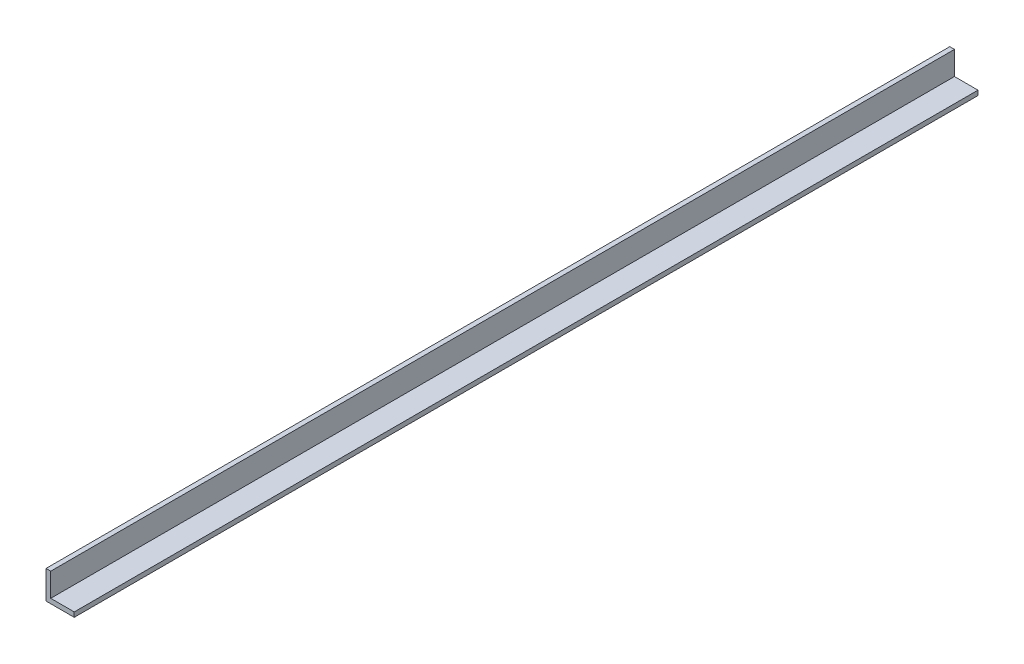
ISO-10303-21;
HEADER;
FILE_DESCRIPTION(('STEP AP214'),'2;1');
FILE_NAME('part.step','',(''),(''),'','','');
FILE_SCHEMA(('AUTOMOTIVE_DESIGN { 1 0 10303 214 1 1 1 1 }'));
ENDSEC;
DATA;
#1=APPLICATION_CONTEXT('core data for automotive mechanical design processes');
#2=APPLICATION_PROTOCOL_DEFINITION('international standard','automotive_design',2000,#1);
#3=PRODUCT_CONTEXT('',#1,'mechanical');
#4=PRODUCT('Part','Part','',(#3));
#5=PRODUCT_RELATED_PRODUCT_CATEGORY('part','',(#4));
#6=PRODUCT_DEFINITION_FORMATION('','',#4);
#7=PRODUCT_DEFINITION_CONTEXT('part definition',#1,'design');
#8=PRODUCT_DEFINITION('design','',#6,#7);
#9=PRODUCT_DEFINITION_SHAPE('','',#8);
#10=(LENGTH_UNIT() NAMED_UNIT(*) SI_UNIT(.MILLI.,.METRE.));
#11=(NAMED_UNIT(*) PLANE_ANGLE_UNIT() SI_UNIT($,.RADIAN.));
#12=(NAMED_UNIT(*) SI_UNIT($,.STERADIAN.) SOLID_ANGLE_UNIT());
#13=UNCERTAINTY_MEASURE_WITH_UNIT(LENGTH_MEASURE(1.E-05),#10,'distance_accuracy_value','');
#14=(GEOMETRIC_REPRESENTATION_CONTEXT(3) GLOBAL_UNCERTAINTY_ASSIGNED_CONTEXT((#13)) GLOBAL_UNIT_ASSIGNED_CONTEXT((#10,
#11,#12)) REPRESENTATION_CONTEXT('',''));
#15=CARTESIAN_POINT('',(0.,0.,0.));
#16=DIRECTION('',(0.,0.,1.));
#17=DIRECTION('',(1.,0.,0.));
#18=AXIS2_PLACEMENT_3D('',#15,#16,#17);
#19=CARTESIAN_POINT('',(0.,19.05,609.6));
#20=DIRECTION('',(1.,0.,0.));
#21=DIRECTION('',(0.,1.,0.));
#22=AXIS2_PLACEMENT_3D('',#19,#20,#21);
#23=PLANE('',#22);
#24=DIRECTION('',(0.,-1.,0.));
#25=VECTOR('',#24,1.);
#26=CARTESIAN_POINT('',(0.,19.05,0.));
#27=LINE('',#26,#25);
#28=CARTESIAN_POINT('',(0.,19.05,0.));
#29=VERTEX_POINT('',#28);
#30=CARTESIAN_POINT('',(0.,0.,0.));
#31=VERTEX_POINT('',#30);
#32=EDGE_CURVE('E114',#29,#31,#27,.T.);
#33=ORIENTED_EDGE('',*,*,#32,.T.);
#34=DIRECTION('',(0.,0.,-1.));
#35=VECTOR('',#34,1.);
#36=CARTESIAN_POINT('',(0.,0.,609.6));
#37=LINE('',#36,#35);
#38=CARTESIAN_POINT('',(0.,0.,609.6));
#39=VERTEX_POINT('',#38);
#40=EDGE_CURVE('E11',#39,#31,#37,.T.);
#41=ORIENTED_EDGE('',*,*,#40,.F.);
#42=DIRECTION('',(0.,-1.,0.));
#43=VECTOR('',#42,1.);
#44=CARTESIAN_POINT('',(0.,19.05,609.6));
#45=LINE('',#44,#43);
#46=CARTESIAN_POINT('',(0.,19.05,609.6));
#47=VERTEX_POINT('',#46);
#48=EDGE_CURVE('E124',#47,#39,#45,.T.);
#49=ORIENTED_EDGE('',*,*,#48,.F.);
#50=DIRECTION('',(0.,0.,-1.));
#51=VECTOR('',#50,1.);
#52=CARTESIAN_POINT('',(0.,19.05,609.6));
#53=LINE('',#52,#51);
#54=EDGE_CURVE('E110',#47,#29,#53,.T.);
#55=ORIENTED_EDGE('',*,*,#54,.T.);
#56=EDGE_LOOP('',(#33,#41,#49,#55));
#57=FACE_BOUND('',#56,.T.);
#58=ADVANCED_FACE('F30',(#57),#23,.F.);
#59=CARTESIAN_POINT('',(0.,0.,609.6));
#60=DIRECTION('',(0.,1.,0.));
#61=DIRECTION('',(0.,0.,1.));
#62=AXIS2_PLACEMENT_3D('',#59,#60,#61);
#63=PLANE('',#62);
#64=DIRECTION('',(1.,0.,0.));
#65=VECTOR('',#64,1.);
#66=CARTESIAN_POINT('',(0.,0.,0.));
#67=LINE('',#66,#65);
#68=CARTESIAN_POINT('',(19.05,0.,0.));
#69=VERTEX_POINT('',#68);
#70=EDGE_CURVE('E117',#31,#69,#67,.T.);
#71=ORIENTED_EDGE('',*,*,#70,.T.);
#72=DIRECTION('',(0.,0.,-1.));
#73=VECTOR('',#72,1.);
#74=CARTESIAN_POINT('',(19.05,0.,609.6));
#75=LINE('',#74,#73);
#76=CARTESIAN_POINT('',(19.05,0.,609.6));
#77=VERTEX_POINT('',#76);
#78=EDGE_CURVE('E38',#77,#69,#75,.T.);
#79=ORIENTED_EDGE('',*,*,#78,.F.);
#80=DIRECTION('',(1.,0.,0.));
#81=VECTOR('',#80,1.);
#82=CARTESIAN_POINT('',(0.,0.,609.6));
#83=LINE('',#82,#81);
#84=EDGE_CURVE('E83',#39,#77,#83,.T.);
#85=ORIENTED_EDGE('',*,*,#84,.F.);
#86=ORIENTED_EDGE('',*,*,#40,.T.);
#87=EDGE_LOOP('',(#71,#79,#85,#86));
#88=FACE_BOUND('',#87,.T.);
#89=ADVANCED_FACE('F148',(#88),#63,.F.);
#90=CARTESIAN_POINT('',(19.05,0.,609.6));
#91=DIRECTION('',(-1.,0.,0.));
#92=DIRECTION('',(0.,0.,1.));
#93=AXIS2_PLACEMENT_3D('',#90,#91,#92);
#94=PLANE('',#93);
#95=DIRECTION('',(0.,1.,0.));
#96=VECTOR('',#95,1.);
#97=CARTESIAN_POINT('',(19.05,0.,0.));
#98=LINE('',#97,#96);
#99=CARTESIAN_POINT('',(19.05,3.175,0.));
#100=VERTEX_POINT('',#99);
#101=EDGE_CURVE('E119',#69,#100,#98,.T.);
#102=ORIENTED_EDGE('',*,*,#101,.T.);
#103=DIRECTION('',(0.,0.,-1.));
#104=VECTOR('',#103,1.);
#105=CARTESIAN_POINT('',(19.05,3.175,609.6));
#106=LINE('',#105,#104);
#107=CARTESIAN_POINT('',(19.05,3.175,609.6));
#108=VERTEX_POINT('',#107);
#109=EDGE_CURVE('E105',#108,#100,#106,.T.);
#110=ORIENTED_EDGE('',*,*,#109,.F.);
#111=DIRECTION('',(0.,1.,0.));
#112=VECTOR('',#111,1.);
#113=CARTESIAN_POINT('',(19.05,0.,609.6));
#114=LINE('',#113,#112);
#115=EDGE_CURVE('E96',#77,#108,#114,.T.);
#116=ORIENTED_EDGE('',*,*,#115,.F.);
#117=ORIENTED_EDGE('',*,*,#78,.T.);
#118=EDGE_LOOP('',(#102,#110,#116,#117));
#119=FACE_BOUND('',#118,.T.);
#120=ADVANCED_FACE('F130',(#119),#94,.F.);
#121=CARTESIAN_POINT('',(19.05,3.175,609.6));
#122=DIRECTION('',(0.,-1.,0.));
#123=DIRECTION('',(1.,0.,0.));
#124=AXIS2_PLACEMENT_3D('',#121,#122,#123);
#125=PLANE('',#124);
#126=DIRECTION('',(-1.,0.,0.));
#127=VECTOR('',#126,1.);
#128=CARTESIAN_POINT('',(19.05,3.175,0.));
#129=LINE('',#128,#127);
#130=CARTESIAN_POINT('',(3.175,3.175,0.));
#131=VERTEX_POINT('',#130);
#132=EDGE_CURVE('E104',#100,#131,#129,.T.);
#133=ORIENTED_EDGE('',*,*,#132,.T.);
#134=DIRECTION('',(0.,0.,-1.));
#135=VECTOR('',#134,1.);
#136=CARTESIAN_POINT('',(3.175,3.175,609.6));
#137=LINE('',#136,#135);
#138=CARTESIAN_POINT('',(3.175,3.175,609.6));
#139=VERTEX_POINT('',#138);
#140=EDGE_CURVE('E101',#139,#131,#137,.T.);
#141=ORIENTED_EDGE('',*,*,#140,.F.);
#142=DIRECTION('',(-1.,0.,0.));
#143=VECTOR('',#142,1.);
#144=CARTESIAN_POINT('',(19.05,3.175,609.6));
#145=LINE('',#144,#143);
#146=EDGE_CURVE('E90',#108,#139,#145,.T.);
#147=ORIENTED_EDGE('',*,*,#146,.F.);
#148=ORIENTED_EDGE('',*,*,#109,.T.);
#149=EDGE_LOOP('',(#133,#141,#147,#148));
#150=FACE_BOUND('',#149,.T.);
#151=ADVANCED_FACE('F102',(#150),#125,.F.);
#152=CARTESIAN_POINT('',(3.175,3.175,609.6));
#153=DIRECTION('',(-1.,0.,0.));
#154=DIRECTION('',(0.,-1.,0.));
#155=AXIS2_PLACEMENT_3D('',#152,#153,#154);
#156=PLANE('',#155);
#157=DIRECTION('',(0.,1.,0.));
#158=VECTOR('',#157,1.);
#159=CARTESIAN_POINT('',(3.175,3.175,0.));
#160=LINE('',#159,#158);
#161=CARTESIAN_POINT('',(3.175,19.05,0.));
#162=VERTEX_POINT('',#161);
#163=EDGE_CURVE('E69',#131,#162,#160,.T.);
#164=ORIENTED_EDGE('',*,*,#163,.T.);
#165=DIRECTION('',(0.,0.,-1.));
#166=VECTOR('',#165,1.);
#167=CARTESIAN_POINT('',(3.175,19.05,609.6));
#168=LINE('',#167,#166);
#169=CARTESIAN_POINT('',(3.175,19.05,609.6));
#170=VERTEX_POINT('',#169);
#171=EDGE_CURVE('E106',#170,#162,#168,.T.);
#172=ORIENTED_EDGE('',*,*,#171,.F.);
#173=DIRECTION('',(0.,1.,0.));
#174=VECTOR('',#173,1.);
#175=CARTESIAN_POINT('',(3.175,3.175,609.6));
#176=LINE('',#175,#174);
#177=EDGE_CURVE('E94',#139,#170,#176,.T.);
#178=ORIENTED_EDGE('',*,*,#177,.F.);
#179=ORIENTED_EDGE('',*,*,#140,.T.);
#180=EDGE_LOOP('',(#164,#172,#178,#179));
#181=FACE_BOUND('',#180,.T.);
#182=ADVANCED_FACE('F108',(#181),#156,.F.);
#183=CARTESIAN_POINT('',(3.175,19.05,609.6));
#184=DIRECTION('',(0.,-1.,0.));
#185=DIRECTION('',(0.,0.,-1.));
#186=AXIS2_PLACEMENT_3D('',#183,#184,#185);
#187=PLANE('',#186);
#188=DIRECTION('',(-1.,0.,0.));
#189=VECTOR('',#188,1.);
#190=CARTESIAN_POINT('',(3.175,19.05,0.));
#191=LINE('',#190,#189);
#192=EDGE_CURVE('E75',#162,#29,#191,.T.);
#193=ORIENTED_EDGE('',*,*,#192,.T.);
#194=ORIENTED_EDGE('',*,*,#54,.F.);
#195=DIRECTION('',(-1.,0.,0.));
#196=VECTOR('',#195,1.);
#197=CARTESIAN_POINT('',(3.175,19.05,609.6));
#198=LINE('',#197,#196);
#199=EDGE_CURVE('E46',#170,#47,#198,.T.);
#200=ORIENTED_EDGE('',*,*,#199,.F.);
#201=ORIENTED_EDGE('',*,*,#171,.T.);
#202=EDGE_LOOP('',(#193,#194,#200,#201));
#203=FACE_BOUND('',#202,.T.);
#204=ADVANCED_FACE('F137',(#203),#187,.F.);
#205=CARTESIAN_POINT('',(0.,0.,609.6));
#206=DIRECTION('',(0.,0.,1.));
#207=DIRECTION('',(1.,0.,0.));
#208=AXIS2_PLACEMENT_3D('',#205,#206,#207);
#209=PLANE('',#208);
#210=ORIENTED_EDGE('',*,*,#48,.T.);
#211=ORIENTED_EDGE('',*,*,#84,.T.);
#212=ORIENTED_EDGE('',*,*,#115,.T.);
#213=ORIENTED_EDGE('',*,*,#146,.T.);
#214=ORIENTED_EDGE('',*,*,#177,.T.);
#215=ORIENTED_EDGE('',*,*,#199,.T.);
#216=EDGE_LOOP('',(#210,#211,#212,#213,#214,#215));
#217=FACE_BOUND('',#216,.T.);
#218=ADVANCED_FACE('F92',(#217),#209,.T.);
#219=CARTESIAN_POINT('',(0.,0.,0.));
#220=DIRECTION('',(0.,0.,1.));
#221=DIRECTION('',(1.,0.,0.));
#222=AXIS2_PLACEMENT_3D('',#219,#220,#221);
#223=PLANE('',#222);
#224=ORIENTED_EDGE('',*,*,#32,.F.);
#225=ORIENTED_EDGE('',*,*,#192,.F.);
#226=ORIENTED_EDGE('',*,*,#163,.F.);
#227=ORIENTED_EDGE('',*,*,#132,.F.);
#228=ORIENTED_EDGE('',*,*,#101,.F.);
#229=ORIENTED_EDGE('',*,*,#70,.F.);
#230=EDGE_LOOP('',(#224,#225,#226,#227,#228,#229));
#231=FACE_BOUND('',#230,.T.);
#232=ADVANCED_FACE('F133',(#231),#223,.F.);
#233=CLOSED_SHELL('',(#58,#89,#120,#151,#182,#204,#218,#232));
#234=MANIFOLD_SOLID_BREP('B2',#233);
#235=ADVANCED_BREP_SHAPE_REPRESENTATION('',(#18,#234),#14);
#236=SHAPE_DEFINITION_REPRESENTATION(#9,#235);
ENDSEC;
END-ISO-10303-21;
